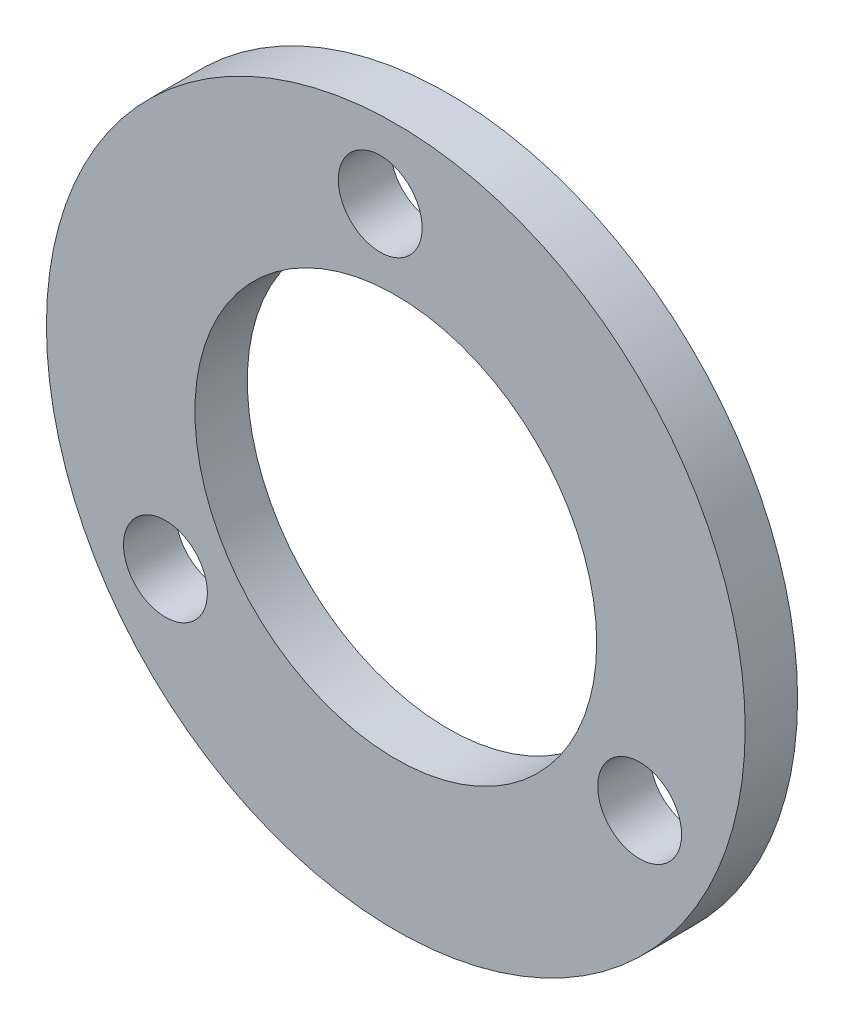
ISO-10303-21;
HEADER;
FILE_DESCRIPTION(('STEP AP214'),'2;1');
FILE_NAME('part.step','',(''),(''),'','','');
FILE_SCHEMA(('AUTOMOTIVE_DESIGN { 1 0 10303 214 1 1 1 1 }'));
ENDSEC;
DATA;
#1=APPLICATION_CONTEXT('core data for automotive mechanical design processes');
#2=APPLICATION_PROTOCOL_DEFINITION('international standard','automotive_design',2000,#1);
#3=PRODUCT_CONTEXT('',#1,'mechanical');
#4=PRODUCT('Part','Part','',(#3));
#5=PRODUCT_RELATED_PRODUCT_CATEGORY('part','',(#4));
#6=PRODUCT_DEFINITION_FORMATION('','',#4);
#7=PRODUCT_DEFINITION_CONTEXT('part definition',#1,'design');
#8=PRODUCT_DEFINITION('design','',#6,#7);
#9=PRODUCT_DEFINITION_SHAPE('','',#8);
#10=(LENGTH_UNIT() NAMED_UNIT(*) SI_UNIT(.MILLI.,.METRE.));
#11=(NAMED_UNIT(*) PLANE_ANGLE_UNIT() SI_UNIT($,.RADIAN.));
#12=(NAMED_UNIT(*) SI_UNIT($,.STERADIAN.) SOLID_ANGLE_UNIT());
#13=UNCERTAINTY_MEASURE_WITH_UNIT(LENGTH_MEASURE(1.E-05),#10,'distance_accuracy_value','');
#14=(GEOMETRIC_REPRESENTATION_CONTEXT(3) GLOBAL_UNCERTAINTY_ASSIGNED_CONTEXT((#13)) GLOBAL_UNIT_ASSIGNED_CONTEXT((#10,
#11,#12)) REPRESENTATION_CONTEXT('',''));
#15=CARTESIAN_POINT('',(0.,0.,0.));
#16=DIRECTION('',(0.,0.,1.));
#17=DIRECTION('',(1.,0.,0.));
#18=AXIS2_PLACEMENT_3D('',#15,#16,#17);
#19=CARTESIAN_POINT('',(0.,0.,3.));
#20=DIRECTION('',(0.,0.,1.));
#21=DIRECTION('',(1.,0.,0.));
#22=AXIS2_PLACEMENT_3D('',#19,#20,#21);
#23=PLANE('',#22);
#24=CARTESIAN_POINT('',(13.9581507944224,-7.06551327066415,3.));
#25=DIRECTION('',(0.,0.,1.));
#26=DIRECTION('',(1.,0.,0.));
#27=AXIS2_PLACEMENT_3D('',#24,#25,#26);
#28=CIRCLE('',#27,2.40000000000003);
#29=CARTESIAN_POINT('',(16.3581507944224,-7.06551327066415,3.));
#30=VERTEX_POINT('',#29);
#31=EDGE_CURVE('E66',#30,#30,#28,.T.);
#32=ORIENTED_EDGE('',*,*,#31,.F.);
#33=EDGE_LOOP('',(#32));
#34=FACE_BOUND('',#33,.T.);
#35=CARTESIAN_POINT('',(-13.1847756528616,-8.66034103679892,3.));
#36=DIRECTION('',(0.,0.,1.));
#37=DIRECTION('',(1.,0.,0.));
#38=AXIS2_PLACEMENT_3D('',#35,#36,#37);
#39=CIRCLE('',#38,2.4);
#40=CARTESIAN_POINT('',(-10.7847756528616,-8.66034103679892,3.));
#41=VERTEX_POINT('',#40);
#42=EDGE_CURVE('E52',#41,#41,#39,.T.);
#43=ORIENTED_EDGE('',*,*,#42,.F.);
#44=EDGE_LOOP('',(#43));
#45=FACE_BOUND('',#44,.T.);
#46=CARTESIAN_POINT('',(0.,0.,3.));
#47=DIRECTION('',(0.,0.,1.));
#48=DIRECTION('',(1.,0.,0.));
#49=AXIS2_PLACEMENT_3D('',#46,#47,#48);
#50=CIRCLE('',#49,20.);
#51=CARTESIAN_POINT('',(20.,0.,3.));
#52=VERTEX_POINT('',#51);
#53=EDGE_CURVE('E10',#52,#52,#50,.T.);
#54=ORIENTED_EDGE('',*,*,#53,.T.);
#55=EDGE_LOOP('',(#54));
#56=FACE_BOUND('',#55,.T.);
#57=CARTESIAN_POINT('',(0.,0.,3.));
#58=DIRECTION('',(0.,0.,1.));
#59=DIRECTION('',(1.,0.,0.));
#60=AXIS2_PLACEMENT_3D('',#57,#58,#59);
#61=CIRCLE('',#60,11.5);
#62=CARTESIAN_POINT('',(11.5,0.,3.));
#63=VERTEX_POINT('',#62);
#64=EDGE_CURVE('E58',#63,#63,#61,.T.);
#65=ORIENTED_EDGE('',*,*,#64,.F.);
#66=EDGE_LOOP('',(#65));
#67=FACE_BOUND('',#66,.T.);
#68=CARTESIAN_POINT('',(-0.891829149567015,15.58282503946,3.));
#69=DIRECTION('',(0.,0.,1.));
#70=DIRECTION('',(1.,0.,0.));
#71=AXIS2_PLACEMENT_3D('',#68,#69,#70);
#72=CIRCLE('',#71,2.40000000000003);
#73=CARTESIAN_POINT('',(1.50817085043302,15.58282503946,3.));
#74=VERTEX_POINT('',#73);
#75=EDGE_CURVE('E74',#74,#74,#72,.T.);
#76=ORIENTED_EDGE('',*,*,#75,.F.);
#77=EDGE_LOOP('',(#76));
#78=FACE_BOUND('',#77,.T.);
#79=ADVANCED_FACE('F39',(#34,#45,#56,#67,#78),#23,.T.);
#80=CARTESIAN_POINT('',(0.,0.,0.));
#81=DIRECTION('',(0.,0.,1.));
#82=DIRECTION('',(1.,0.,0.));
#83=AXIS2_PLACEMENT_3D('',#80,#81,#82);
#84=PLANE('',#83);
#85=CARTESIAN_POINT('',(0.,0.,0.));
#86=DIRECTION('',(0.,0.,1.));
#87=DIRECTION('',(1.,0.,0.));
#88=AXIS2_PLACEMENT_3D('',#85,#86,#87);
#89=CIRCLE('',#88,20.);
#90=CARTESIAN_POINT('',(20.,0.,0.));
#91=VERTEX_POINT('',#90);
#92=EDGE_CURVE('E43',#91,#91,#89,.T.);
#93=ORIENTED_EDGE('',*,*,#92,.F.);
#94=EDGE_LOOP('',(#93));
#95=FACE_BOUND('',#94,.T.);
#96=CARTESIAN_POINT('',(-13.1847756528616,-8.66034103679892,0.));
#97=DIRECTION('',(0.,0.,1.));
#98=DIRECTION('',(1.,0.,0.));
#99=AXIS2_PLACEMENT_3D('',#96,#97,#98);
#100=CIRCLE('',#99,2.4);
#101=CARTESIAN_POINT('',(-10.7847756528616,-8.66034103679892,0.));
#102=VERTEX_POINT('',#101);
#103=EDGE_CURVE('E54',#102,#102,#100,.T.);
#104=ORIENTED_EDGE('',*,*,#103,.T.);
#105=EDGE_LOOP('',(#104));
#106=FACE_BOUND('',#105,.T.);
#107=CARTESIAN_POINT('',(0.,0.,0.));
#108=DIRECTION('',(0.,0.,1.));
#109=DIRECTION('',(1.,0.,0.));
#110=AXIS2_PLACEMENT_3D('',#107,#108,#109);
#111=CIRCLE('',#110,11.5);
#112=CARTESIAN_POINT('',(11.5,0.,0.));
#113=VERTEX_POINT('',#112);
#114=EDGE_CURVE('E62',#113,#113,#111,.T.);
#115=ORIENTED_EDGE('',*,*,#114,.T.);
#116=EDGE_LOOP('',(#115));
#117=FACE_BOUND('',#116,.T.);
#118=CARTESIAN_POINT('',(13.9581507944224,-7.06551327066415,0.));
#119=DIRECTION('',(0.,0.,1.));
#120=DIRECTION('',(1.,0.,0.));
#121=AXIS2_PLACEMENT_3D('',#118,#119,#120);
#122=CIRCLE('',#121,2.40000000000003);
#123=CARTESIAN_POINT('',(16.3581507944224,-7.06551327066415,0.));
#124=VERTEX_POINT('',#123);
#125=EDGE_CURVE('E70',#124,#124,#122,.T.);
#126=ORIENTED_EDGE('',*,*,#125,.T.);
#127=EDGE_LOOP('',(#126));
#128=FACE_BOUND('',#127,.T.);
#129=CARTESIAN_POINT('',(-0.891829149567015,15.58282503946,0.));
#130=DIRECTION('',(0.,0.,1.));
#131=DIRECTION('',(1.,0.,0.));
#132=AXIS2_PLACEMENT_3D('',#129,#130,#131);
#133=CIRCLE('',#132,2.40000000000003);
#134=CARTESIAN_POINT('',(1.50817085043302,15.58282503946,0.));
#135=VERTEX_POINT('',#134);
#136=EDGE_CURVE('E78',#135,#135,#133,.T.);
#137=ORIENTED_EDGE('',*,*,#136,.T.);
#138=EDGE_LOOP('',(#137));
#139=FACE_BOUND('',#138,.T.);
#140=ADVANCED_FACE('F90',(#95,#106,#117,#128,#139),#84,.F.);
#141=CARTESIAN_POINT('',(0.,0.,3.));
#142=DIRECTION('',(0.,0.,-1.));
#143=DIRECTION('',(-1.,0.,0.));
#144=AXIS2_PLACEMENT_3D('',#141,#142,#143);
#145=CYLINDRICAL_SURFACE('',#144,20.);
#146=ORIENTED_EDGE('',*,*,#53,.F.);
#147=EDGE_LOOP('',(#146));
#148=FACE_BOUND('',#147,.T.);
#149=ORIENTED_EDGE('',*,*,#92,.T.);
#150=EDGE_LOOP('',(#149));
#151=FACE_BOUND('',#150,.T.);
#152=ADVANCED_FACE('F41',(#148,#151),#145,.T.);
#153=CARTESIAN_POINT('',(-13.1847756528616,-8.66034103679892,3.));
#154=DIRECTION('',(0.,0.,-1.));
#155=DIRECTION('',(-1.,0.,0.));
#156=AXIS2_PLACEMENT_3D('',#153,#154,#155);
#157=CYLINDRICAL_SURFACE('',#156,2.4);
#158=ORIENTED_EDGE('',*,*,#42,.T.);
#159=EDGE_LOOP('',(#158));
#160=FACE_BOUND('',#159,.T.);
#161=ORIENTED_EDGE('',*,*,#103,.F.);
#162=EDGE_LOOP('',(#161));
#163=FACE_BOUND('',#162,.T.);
#164=ADVANCED_FACE('F100',(#160,#163),#157,.F.);
#165=CARTESIAN_POINT('',(0.,0.,3.));
#166=DIRECTION('',(0.,0.,-1.));
#167=DIRECTION('',(-1.,0.,0.));
#168=AXIS2_PLACEMENT_3D('',#165,#166,#167);
#169=CYLINDRICAL_SURFACE('',#168,11.5);
#170=ORIENTED_EDGE('',*,*,#64,.T.);
#171=EDGE_LOOP('',(#170));
#172=FACE_BOUND('',#171,.T.);
#173=ORIENTED_EDGE('',*,*,#114,.F.);
#174=EDGE_LOOP('',(#173));
#175=FACE_BOUND('',#174,.T.);
#176=ADVANCED_FACE('F103',(#172,#175),#169,.F.);
#177=CARTESIAN_POINT('',(13.9581507944224,-7.06551327066415,3.));
#178=DIRECTION('',(0.,0.,-1.));
#179=DIRECTION('',(-1.,0.,0.));
#180=AXIS2_PLACEMENT_3D('',#177,#178,#179);
#181=CYLINDRICAL_SURFACE('',#180,2.40000000000003);
#182=ORIENTED_EDGE('',*,*,#31,.T.);
#183=EDGE_LOOP('',(#182));
#184=FACE_BOUND('',#183,.T.);
#185=ORIENTED_EDGE('',*,*,#125,.F.);
#186=EDGE_LOOP('',(#185));
#187=FACE_BOUND('',#186,.T.);
#188=ADVANCED_FACE('F107',(#184,#187),#181,.F.);
#189=CARTESIAN_POINT('',(-0.891829149567015,15.58282503946,3.));
#190=DIRECTION('',(0.,0.,-1.));
#191=DIRECTION('',(-1.,0.,0.));
#192=AXIS2_PLACEMENT_3D('',#189,#190,#191);
#193=CYLINDRICAL_SURFACE('',#192,2.40000000000003);
#194=ORIENTED_EDGE('',*,*,#75,.T.);
#195=EDGE_LOOP('',(#194));
#196=FACE_BOUND('',#195,.T.);
#197=ORIENTED_EDGE('',*,*,#136,.F.);
#198=EDGE_LOOP('',(#197));
#199=FACE_BOUND('',#198,.T.);
#200=ADVANCED_FACE('F86',(#196,#199),#193,.F.);
#201=CLOSED_SHELL('',(#79,#140,#152,#164,#176,#188,#200));
#202=MANIFOLD_SOLID_BREP('B2',#201);
#203=ADVANCED_BREP_SHAPE_REPRESENTATION('',(#18,#202),#14);
#204=SHAPE_DEFINITION_REPRESENTATION(#9,#203);
ENDSEC;
END-ISO-10303-21;
